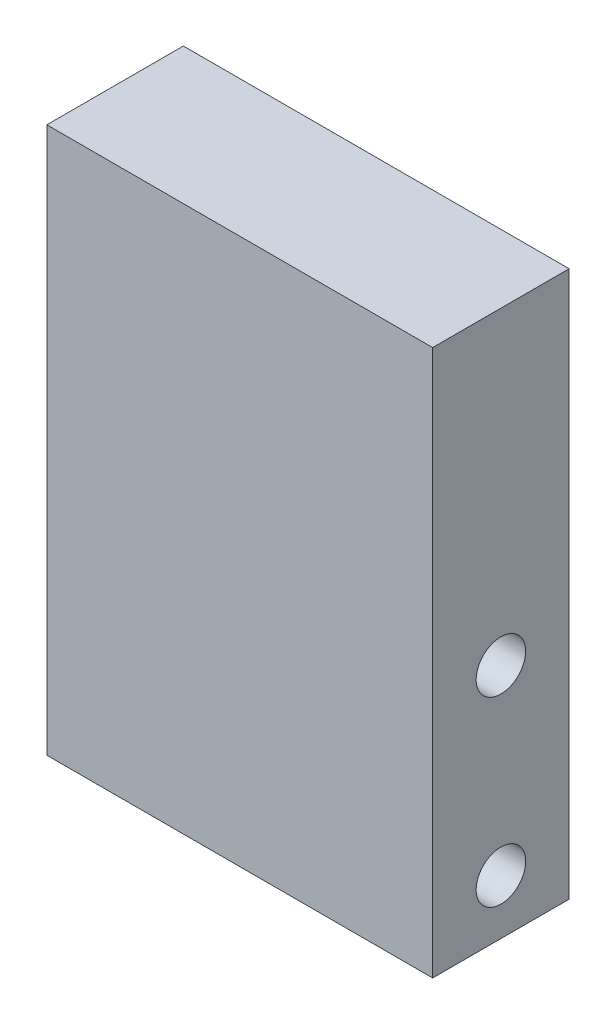
ISO-10303-21;
HEADER;
FILE_DESCRIPTION(('STEP AP214'),'2;1');
FILE_NAME('part.step','',(''),(''),'','','');
FILE_SCHEMA(('AUTOMOTIVE_DESIGN { 1 0 10303 214 1 1 1 1 }'));
ENDSEC;
DATA;
#1=APPLICATION_CONTEXT('core data for automotive mechanical design processes');
#2=APPLICATION_PROTOCOL_DEFINITION('international standard','automotive_design',2000,#1);
#3=PRODUCT_CONTEXT('',#1,'mechanical');
#4=PRODUCT('Part','Part','',(#3));
#5=PRODUCT_RELATED_PRODUCT_CATEGORY('part','',(#4));
#6=PRODUCT_DEFINITION_FORMATION('','',#4);
#7=PRODUCT_DEFINITION_CONTEXT('part definition',#1,'design');
#8=PRODUCT_DEFINITION('design','',#6,#7);
#9=PRODUCT_DEFINITION_SHAPE('','',#8);
#10=(LENGTH_UNIT() NAMED_UNIT(*) SI_UNIT(.MILLI.,.METRE.));
#11=(NAMED_UNIT(*) PLANE_ANGLE_UNIT() SI_UNIT($,.RADIAN.));
#12=(NAMED_UNIT(*) SI_UNIT($,.STERADIAN.) SOLID_ANGLE_UNIT());
#13=UNCERTAINTY_MEASURE_WITH_UNIT(LENGTH_MEASURE(1.E-05),#10,'distance_accuracy_value','');
#14=(GEOMETRIC_REPRESENTATION_CONTEXT(3) GLOBAL_UNCERTAINTY_ASSIGNED_CONTEXT((#13)) GLOBAL_UNIT_ASSIGNED_CONTEXT((#10,
#11,#12)) REPRESENTATION_CONTEXT('',''));
#15=CARTESIAN_POINT('',(0.,0.,0.));
#16=DIRECTION('',(0.,0.,1.));
#17=DIRECTION('',(1.,0.,0.));
#18=AXIS2_PLACEMENT_3D('',#15,#16,#17);
#19=CARTESIAN_POINT('',(13.462,19.05,4.7625));
#20=DIRECTION('',(-1.,0.,0.));
#21=DIRECTION('',(0.,-1.,0.));
#22=AXIS2_PLACEMENT_3D('',#19,#20,#21);
#23=PLANE('',#22);
#24=CARTESIAN_POINT('',(13.462,-15.24,0.));
#25=DIRECTION('',(1.,0.,0.));
#26=DIRECTION('',(0.,0.,-1.));
#27=AXIS2_PLACEMENT_3D('',#24,#25,#26);
#28=CIRCLE('',#27,1.72719999999999);
#29=CARTESIAN_POINT('',(13.462,-15.24,-1.72719999999999));
#30=VERTEX_POINT('',#29);
#31=EDGE_CURVE('E139',#30,#30,#28,.T.);
#32=ORIENTED_EDGE('',*,*,#31,.F.);
#33=EDGE_LOOP('',(#32));
#34=FACE_BOUND('',#33,.T.);
#35=DIRECTION('',(0.,1.,0.));
#36=VECTOR('',#35,1.);
#37=CARTESIAN_POINT('',(13.462,19.05,-4.7625));
#38=LINE('',#37,#36);
#39=CARTESIAN_POINT('',(13.462,-19.05,-4.7625));
#40=VERTEX_POINT('',#39);
#41=CARTESIAN_POINT('',(13.462,19.05,-4.7625));
#42=VERTEX_POINT('',#41);
#43=EDGE_CURVE('E73',#40,#42,#38,.T.);
#44=ORIENTED_EDGE('',*,*,#43,.T.);
#45=DIRECTION('',(0.,0.,-1.));
#46=VECTOR('',#45,1.);
#47=CARTESIAN_POINT('',(13.462,19.05,4.7625));
#48=LINE('',#47,#46);
#49=CARTESIAN_POINT('',(13.462,19.05,4.7625));
#50=VERTEX_POINT('',#49);
#51=EDGE_CURVE('E98',#50,#42,#48,.T.);
#52=ORIENTED_EDGE('',*,*,#51,.F.);
#53=DIRECTION('',(0.,1.,0.));
#54=VECTOR('',#53,1.);
#55=CARTESIAN_POINT('',(13.462,19.05,4.7625));
#56=LINE('',#55,#54);
#57=CARTESIAN_POINT('',(13.462,-19.05,4.7625));
#58=VERTEX_POINT('',#57);
#59=EDGE_CURVE('E89',#58,#50,#56,.T.);
#60=ORIENTED_EDGE('',*,*,#59,.F.);
#61=DIRECTION('',(0.,0.,-1.));
#62=VECTOR('',#61,1.);
#63=CARTESIAN_POINT('',(13.462,-19.05,4.7625));
#64=LINE('',#63,#62);
#65=EDGE_CURVE('E48',#58,#40,#64,.T.);
#66=ORIENTED_EDGE('',*,*,#65,.T.);
#67=EDGE_LOOP('',(#44,#52,#60,#66));
#68=FACE_BOUND('',#67,.T.);
#69=CARTESIAN_POINT('',(13.462,-2.54,0.));
#70=DIRECTION('',(1.,0.,0.));
#71=DIRECTION('',(0.,0.,-1.));
#72=AXIS2_PLACEMENT_3D('',#69,#70,#71);
#73=CIRCLE('',#72,1.72719999999999);
#74=CARTESIAN_POINT('',(13.462,-2.54,-1.72719999999999));
#75=VERTEX_POINT('',#74);
#76=EDGE_CURVE('E132',#75,#75,#73,.T.);
#77=ORIENTED_EDGE('',*,*,#76,.F.);
#78=EDGE_LOOP('',(#77));
#79=FACE_BOUND('',#78,.T.);
#80=ADVANCED_FACE('F38',(#34,#68,#79),#23,.F.);
#81=CARTESIAN_POINT('',(-13.462,19.05,4.7625));
#82=DIRECTION('',(1.,0.,0.));
#83=DIRECTION('',(0.,1.,0.));
#84=AXIS2_PLACEMENT_3D('',#81,#82,#83);
#85=PLANE('',#84);
#86=CARTESIAN_POINT('',(-13.462,-15.24,0.));
#87=DIRECTION('',(1.,0.,0.));
#88=DIRECTION('',(0.,1.,0.));
#89=AXIS2_PLACEMENT_3D('',#86,#87,#88);
#90=CIRCLE('',#89,1.72719999999999);
#91=CARTESIAN_POINT('',(-13.462,-13.5128,0.));
#92=VERTEX_POINT('',#91);
#93=EDGE_CURVE('E135',#92,#92,#90,.T.);
#94=ORIENTED_EDGE('',*,*,#93,.T.);
#95=EDGE_LOOP('',(#94));
#96=FACE_BOUND('',#95,.T.);
#97=CARTESIAN_POINT('',(-13.462,-2.54,0.));
#98=DIRECTION('',(1.,0.,0.));
#99=DIRECTION('',(0.,1.,0.));
#100=AXIS2_PLACEMENT_3D('',#97,#98,#99);
#101=CIRCLE('',#100,1.72719999999999);
#102=CARTESIAN_POINT('',(-13.462,-0.812800000000014,0.));
#103=VERTEX_POINT('',#102);
#104=EDGE_CURVE('E113',#103,#103,#101,.T.);
#105=ORIENTED_EDGE('',*,*,#104,.T.);
#106=EDGE_LOOP('',(#105));
#107=FACE_BOUND('',#106,.T.);
#108=DIRECTION('',(0.,-1.,0.));
#109=VECTOR('',#108,1.);
#110=CARTESIAN_POINT('',(-13.462,19.05,-4.7625));
#111=LINE('',#110,#109);
#112=CARTESIAN_POINT('',(-13.462,19.05,-4.7625));
#113=VERTEX_POINT('',#112);
#114=CARTESIAN_POINT('',(-13.462,-19.05,-4.7625));
#115=VERTEX_POINT('',#114);
#116=EDGE_CURVE('E109',#113,#115,#111,.T.);
#117=ORIENTED_EDGE('',*,*,#116,.T.);
#118=DIRECTION('',(0.,0.,-1.));
#119=VECTOR('',#118,1.);
#120=CARTESIAN_POINT('',(-13.462,-19.05,4.7625));
#121=LINE('',#120,#119);
#122=CARTESIAN_POINT('',(-13.462,-19.05,4.7625));
#123=VERTEX_POINT('',#122);
#124=EDGE_CURVE('E11',#123,#115,#121,.T.);
#125=ORIENTED_EDGE('',*,*,#124,.F.);
#126=DIRECTION('',(0.,-1.,0.));
#127=VECTOR('',#126,1.);
#128=CARTESIAN_POINT('',(-13.462,19.05,4.7625));
#129=LINE('',#128,#127);
#130=CARTESIAN_POINT('',(-13.462,19.05,4.7625));
#131=VERTEX_POINT('',#130);
#132=EDGE_CURVE('E91',#131,#123,#129,.T.);
#133=ORIENTED_EDGE('',*,*,#132,.F.);
#134=DIRECTION('',(0.,0.,-1.));
#135=VECTOR('',#134,1.);
#136=CARTESIAN_POINT('',(-13.462,19.05,4.7625));
#137=LINE('',#136,#135);
#138=EDGE_CURVE('E105',#131,#113,#137,.T.);
#139=ORIENTED_EDGE('',*,*,#138,.T.);
#140=EDGE_LOOP('',(#117,#125,#133,#139));
#141=FACE_BOUND('',#140,.T.);
#142=ADVANCED_FACE('F40',(#96,#107,#141),#85,.F.);
#143=CARTESIAN_POINT('',(-13.462,-19.05,4.7625));
#144=DIRECTION('',(0.,1.,0.));
#145=DIRECTION('',(0.,0.,1.));
#146=AXIS2_PLACEMENT_3D('',#143,#144,#145);
#147=PLANE('',#146);
#148=DIRECTION('',(1.,0.,0.));
#149=VECTOR('',#148,1.);
#150=CARTESIAN_POINT('',(-13.462,-19.05,-4.7625));
#151=LINE('',#150,#149);
#152=EDGE_CURVE('E96',#115,#40,#151,.T.);
#153=ORIENTED_EDGE('',*,*,#152,.T.);
#154=ORIENTED_EDGE('',*,*,#65,.F.);
#155=DIRECTION('',(1.,0.,0.));
#156=VECTOR('',#155,1.);
#157=CARTESIAN_POINT('',(-13.462,-19.05,4.7625));
#158=LINE('',#157,#156);
#159=EDGE_CURVE('E86',#123,#58,#158,.T.);
#160=ORIENTED_EDGE('',*,*,#159,.F.);
#161=ORIENTED_EDGE('',*,*,#124,.T.);
#162=EDGE_LOOP('',(#153,#154,#160,#161));
#163=FACE_BOUND('',#162,.T.);
#164=ADVANCED_FACE('F95',(#163),#147,.F.);
#165=CARTESIAN_POINT('',(-13.462,19.05,4.7625));
#166=DIRECTION('',(0.,-1.,0.));
#167=DIRECTION('',(0.,0.,-1.));
#168=AXIS2_PLACEMENT_3D('',#165,#166,#167);
#169=PLANE('',#168);
#170=DIRECTION('',(-1.,0.,0.));
#171=VECTOR('',#170,1.);
#172=CARTESIAN_POINT('',(-13.462,19.05,-4.7625));
#173=LINE('',#172,#171);
#174=EDGE_CURVE('E79',#42,#113,#173,.T.);
#175=ORIENTED_EDGE('',*,*,#174,.T.);
#176=ORIENTED_EDGE('',*,*,#138,.F.);
#177=DIRECTION('',(-1.,0.,0.));
#178=VECTOR('',#177,1.);
#179=CARTESIAN_POINT('',(-13.462,19.05,4.7625));
#180=LINE('',#179,#178);
#181=EDGE_CURVE('E56',#50,#131,#180,.T.);
#182=ORIENTED_EDGE('',*,*,#181,.F.);
#183=ORIENTED_EDGE('',*,*,#51,.T.);
#184=EDGE_LOOP('',(#175,#176,#182,#183));
#185=FACE_BOUND('',#184,.T.);
#186=ADVANCED_FACE('F123',(#185),#169,.F.);
#187=CARTESIAN_POINT('',(0.,0.,4.7625));
#188=DIRECTION('',(0.,0.,1.));
#189=DIRECTION('',(1.,0.,0.));
#190=AXIS2_PLACEMENT_3D('',#187,#188,#189);
#191=PLANE('',#190);
#192=ORIENTED_EDGE('',*,*,#132,.T.);
#193=ORIENTED_EDGE('',*,*,#159,.T.);
#194=ORIENTED_EDGE('',*,*,#59,.T.);
#195=ORIENTED_EDGE('',*,*,#181,.T.);
#196=EDGE_LOOP('',(#192,#193,#194,#195));
#197=FACE_BOUND('',#196,.T.);
#198=ADVANCED_FACE('F87',(#197),#191,.T.);
#199=CARTESIAN_POINT('',(0.,0.,-4.7625));
#200=DIRECTION('',(0.,0.,1.));
#201=DIRECTION('',(1.,0.,0.));
#202=AXIS2_PLACEMENT_3D('',#199,#200,#201);
#203=PLANE('',#202);
#204=ORIENTED_EDGE('',*,*,#116,.F.);
#205=ORIENTED_EDGE('',*,*,#174,.F.);
#206=ORIENTED_EDGE('',*,*,#43,.F.);
#207=ORIENTED_EDGE('',*,*,#152,.F.);
#208=EDGE_LOOP('',(#204,#205,#206,#207));
#209=FACE_BOUND('',#208,.T.);
#210=ADVANCED_FACE('F126',(#209),#203,.F.);
#211=CARTESIAN_POINT('',(13.462,-2.54,0.));
#212=DIRECTION('',(1.,0.,0.));
#213=DIRECTION('',(0.,0.,-1.));
#214=AXIS2_PLACEMENT_3D('',#211,#212,#213);
#215=CYLINDRICAL_SURFACE('',#214,1.72719999999999);
#216=ORIENTED_EDGE('',*,*,#104,.F.);
#217=EDGE_LOOP('',(#216));
#218=FACE_BOUND('',#217,.T.);
#219=ORIENTED_EDGE('',*,*,#76,.T.);
#220=EDGE_LOOP('',(#219));
#221=FACE_BOUND('',#220,.T.);
#222=ADVANCED_FACE('F165',(#218,#221),#215,.F.);
#223=CARTESIAN_POINT('',(13.462,-15.24,0.));
#224=DIRECTION('',(1.,0.,0.));
#225=DIRECTION('',(0.,0.,-1.));
#226=AXIS2_PLACEMENT_3D('',#223,#224,#225);
#227=CYLINDRICAL_SURFACE('',#226,1.72719999999999);
#228=ORIENTED_EDGE('',*,*,#93,.F.);
#229=EDGE_LOOP('',(#228));
#230=FACE_BOUND('',#229,.T.);
#231=ORIENTED_EDGE('',*,*,#31,.T.);
#232=EDGE_LOOP('',(#231));
#233=FACE_BOUND('',#232,.T.);
#234=ADVANCED_FACE('F144',(#230,#233),#227,.F.);
#235=CLOSED_SHELL('',(#80,#142,#164,#186,#198,#210,#222,#234));
#236=MANIFOLD_SOLID_BREP('B2',#235);
#237=ADVANCED_BREP_SHAPE_REPRESENTATION('',(#18,#236),#14);
#238=SHAPE_DEFINITION_REPRESENTATION(#9,#237);
ENDSEC;
END-ISO-10303-21;
